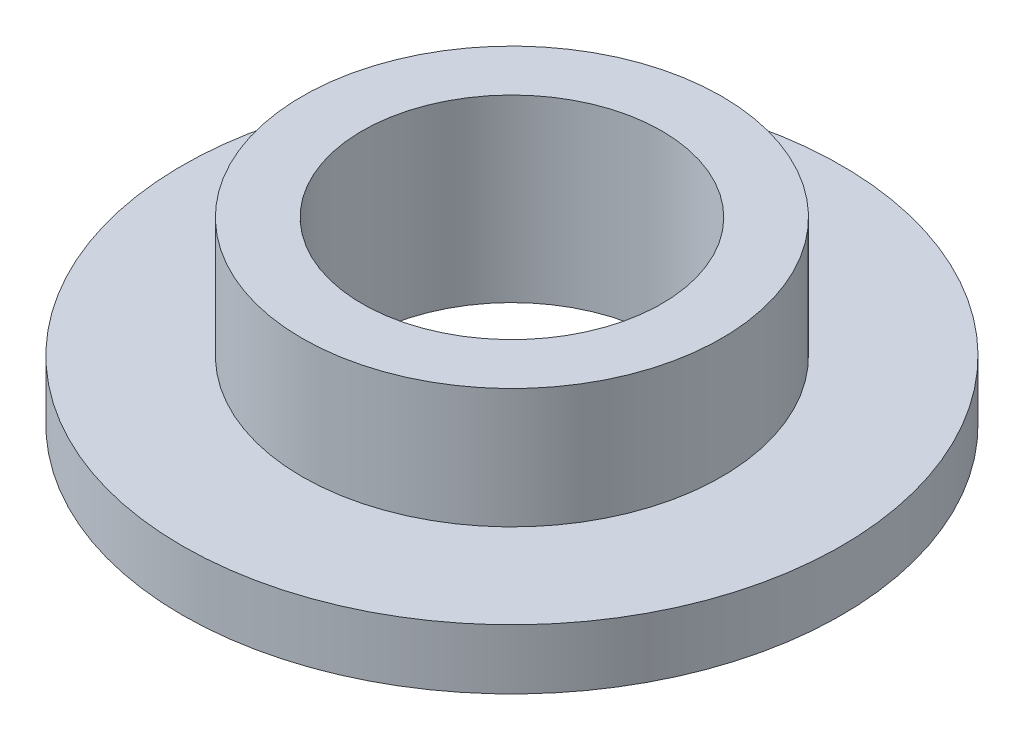
ISO-10303-21;
HEADER;
FILE_DESCRIPTION(('STEP AP214'),'2;1');
FILE_NAME('part.step','',(''),(''),'','','');
FILE_SCHEMA(('AUTOMOTIVE_DESIGN { 1 0 10303 214 1 1 1 1 }'));
ENDSEC;
DATA;
#1=APPLICATION_CONTEXT('core data for automotive mechanical design processes');
#2=APPLICATION_PROTOCOL_DEFINITION('international standard','automotive_design',2000,#1);
#3=PRODUCT_CONTEXT('',#1,'mechanical');
#4=PRODUCT('Part','Part','',(#3));
#5=PRODUCT_RELATED_PRODUCT_CATEGORY('part','',(#4));
#6=PRODUCT_DEFINITION_FORMATION('','',#4);
#7=PRODUCT_DEFINITION_CONTEXT('part definition',#1,'design');
#8=PRODUCT_DEFINITION('design','',#6,#7);
#9=PRODUCT_DEFINITION_SHAPE('','',#8);
#10=(LENGTH_UNIT() NAMED_UNIT(*) SI_UNIT(.MILLI.,.METRE.));
#11=(NAMED_UNIT(*) PLANE_ANGLE_UNIT() SI_UNIT($,.RADIAN.));
#12=(NAMED_UNIT(*) SI_UNIT($,.STERADIAN.) SOLID_ANGLE_UNIT());
#13=UNCERTAINTY_MEASURE_WITH_UNIT(LENGTH_MEASURE(1.E-05),#10,'distance_accuracy_value','');
#14=(GEOMETRIC_REPRESENTATION_CONTEXT(3) GLOBAL_UNCERTAINTY_ASSIGNED_CONTEXT((#13)) GLOBAL_UNIT_ASSIGNED_CONTEXT((#10,
#11,#12)) REPRESENTATION_CONTEXT('',''));
#15=CARTESIAN_POINT('',(0.,0.,0.));
#16=DIRECTION('',(0.,0.,1.));
#17=DIRECTION('',(1.,0.,0.));
#18=AXIS2_PLACEMENT_3D('',#15,#16,#17);
#19=CARTESIAN_POINT('',(0.,3.,-2.5));
#20=DIRECTION('',(0.,1.,0.));
#21=DIRECTION('',(0.,0.,1.));
#22=AXIS2_PLACEMENT_3D('',#19,#20,#21);
#23=PLANE('',#22);
#24=CARTESIAN_POINT('',(0.,3.,0.));
#25=DIRECTION('',(0.,-1.,0.));
#26=DIRECTION('',(0.,0.,-1.));
#27=AXIS2_PLACEMENT_3D('',#24,#25,#26);
#28=CIRCLE('',#27,2.5);
#29=CARTESIAN_POINT('',(0.,3.,-2.5));
#30=VERTEX_POINT('',#29);
#31=EDGE_CURVE('E44',#30,#30,#28,.T.);
#32=ORIENTED_EDGE('',*,*,#31,.T.);
#33=EDGE_LOOP('',(#32));
#34=FACE_BOUND('',#33,.T.);
#35=CARTESIAN_POINT('',(0.,3.,0.));
#36=DIRECTION('',(0.,-1.,0.));
#37=DIRECTION('',(0.,0.,-1.));
#38=AXIS2_PLACEMENT_3D('',#35,#36,#37);
#39=CIRCLE('',#38,3.5);
#40=CARTESIAN_POINT('',(0.,3.,-3.5));
#41=VERTEX_POINT('',#40);
#42=EDGE_CURVE('E36',#41,#41,#39,.T.);
#43=ORIENTED_EDGE('',*,*,#42,.F.);
#44=EDGE_LOOP('',(#43));
#45=FACE_BOUND('',#44,.T.);
#46=ADVANCED_FACE('F30',(#34,#45),#23,.T.);
#47=CARTESIAN_POINT('',(0.,0.,0.));
#48=DIRECTION('',(0.,-1.,0.));
#49=DIRECTION('',(0.,0.,-1.));
#50=AXIS2_PLACEMENT_3D('',#47,#48,#49);
#51=CYLINDRICAL_SURFACE('',#50,3.5);
#52=CARTESIAN_POINT('',(0.,1.,0.));
#53=DIRECTION('',(0.,1.,0.));
#54=DIRECTION('',(0.,0.,1.));
#55=AXIS2_PLACEMENT_3D('',#52,#53,#54);
#56=CIRCLE('',#55,3.5);
#57=CARTESIAN_POINT('',(0.,1.,3.5));
#58=VERTEX_POINT('',#57);
#59=EDGE_CURVE('E10',#58,#58,#56,.F.);
#60=ORIENTED_EDGE('',*,*,#59,.F.);
#61=EDGE_LOOP('',(#60));
#62=FACE_BOUND('',#61,.T.);
#63=ORIENTED_EDGE('',*,*,#42,.T.);
#64=EDGE_LOOP('',(#63));
#65=FACE_BOUND('',#64,.T.);
#66=ADVANCED_FACE('F67',(#62,#65),#51,.T.);
#67=CARTESIAN_POINT('',(0.,0.,-3.5));
#68=DIRECTION('',(0.,-1.,0.));
#69=DIRECTION('',(0.,0.,-1.));
#70=AXIS2_PLACEMENT_3D('',#67,#68,#69);
#71=PLANE('',#70);
#72=CARTESIAN_POINT('',(0.,0.,0.));
#73=DIRECTION('',(0.,-1.,0.));
#74=DIRECTION('',(0.,0.,-1.));
#75=AXIS2_PLACEMENT_3D('',#72,#73,#74);
#76=CIRCLE('',#75,2.5);
#77=CARTESIAN_POINT('',(0.,0.,-2.5));
#78=VERTEX_POINT('',#77);
#79=EDGE_CURVE('E40',#78,#78,#76,.T.);
#80=ORIENTED_EDGE('',*,*,#79,.F.);
#81=EDGE_LOOP('',(#80));
#82=FACE_BOUND('',#81,.T.);
#83=CARTESIAN_POINT('',(0.,0.,0.));
#84=DIRECTION('',(0.,1.,0.));
#85=DIRECTION('',(0.,0.,1.));
#86=AXIS2_PLACEMENT_3D('',#83,#84,#85);
#87=CIRCLE('',#86,5.5);
#88=CARTESIAN_POINT('',(0.,0.,5.5));
#89=VERTEX_POINT('',#88);
#90=EDGE_CURVE('E50',#89,#89,#87,.T.);
#91=ORIENTED_EDGE('',*,*,#90,.F.);
#92=EDGE_LOOP('',(#91));
#93=FACE_BOUND('',#92,.T.);
#94=ADVANCED_FACE('F64',(#82,#93),#71,.T.);
#95=CARTESIAN_POINT('',(0.,0.,0.));
#96=DIRECTION('',(0.,-1.,0.));
#97=DIRECTION('',(0.,0.,-1.));
#98=AXIS2_PLACEMENT_3D('',#95,#96,#97);
#99=CYLINDRICAL_SURFACE('',#98,2.5);
#100=ORIENTED_EDGE('',*,*,#79,.T.);
#101=EDGE_LOOP('',(#100));
#102=FACE_BOUND('',#101,.T.);
#103=ORIENTED_EDGE('',*,*,#31,.F.);
#104=EDGE_LOOP('',(#103));
#105=FACE_BOUND('',#104,.T.);
#106=ADVANCED_FACE('F66',(#102,#105),#99,.F.);
#107=CARTESIAN_POINT('',(0.,1.,0.));
#108=DIRECTION('',(0.,1.,0.));
#109=DIRECTION('',(0.,0.,1.));
#110=AXIS2_PLACEMENT_3D('',#107,#108,#109);
#111=PLANE('',#110);
#112=CARTESIAN_POINT('',(0.,1.,0.));
#113=DIRECTION('',(0.,1.,0.));
#114=DIRECTION('',(0.,0.,1.));
#115=AXIS2_PLACEMENT_3D('',#112,#113,#114);
#116=CIRCLE('',#115,5.5);
#117=CARTESIAN_POINT('',(0.,1.,5.5));
#118=VERTEX_POINT('',#117);
#119=EDGE_CURVE('E49',#118,#118,#116,.T.);
#120=ORIENTED_EDGE('',*,*,#119,.T.);
#121=EDGE_LOOP('',(#120));
#122=FACE_BOUND('',#121,.T.);
#123=ORIENTED_EDGE('',*,*,#59,.T.);
#124=EDGE_LOOP('',(#123));
#125=FACE_BOUND('',#124,.T.);
#126=ADVANCED_FACE('F56',(#122,#125),#111,.T.);
#127=CARTESIAN_POINT('',(0.,1.,0.));
#128=DIRECTION('',(0.,-1.,0.));
#129=DIRECTION('',(0.,0.,-1.));
#130=AXIS2_PLACEMENT_3D('',#127,#128,#129);
#131=CYLINDRICAL_SURFACE('',#130,5.5);
#132=ORIENTED_EDGE('',*,*,#119,.F.);
#133=EDGE_LOOP('',(#132));
#134=FACE_BOUND('',#133,.T.);
#135=ORIENTED_EDGE('',*,*,#90,.T.);
#136=EDGE_LOOP('',(#135));
#137=FACE_BOUND('',#136,.T.);
#138=ADVANCED_FACE('F58',(#134,#137),#131,.T.);
#139=CLOSED_SHELL('',(#46,#66,#94,#106,#126,#138));
#140=MANIFOLD_SOLID_BREP('B2',#139);
#141=ADVANCED_BREP_SHAPE_REPRESENTATION('',(#18,#140),#14);
#142=SHAPE_DEFINITION_REPRESENTATION(#9,#141);
ENDSEC;
END-ISO-10303-21;
